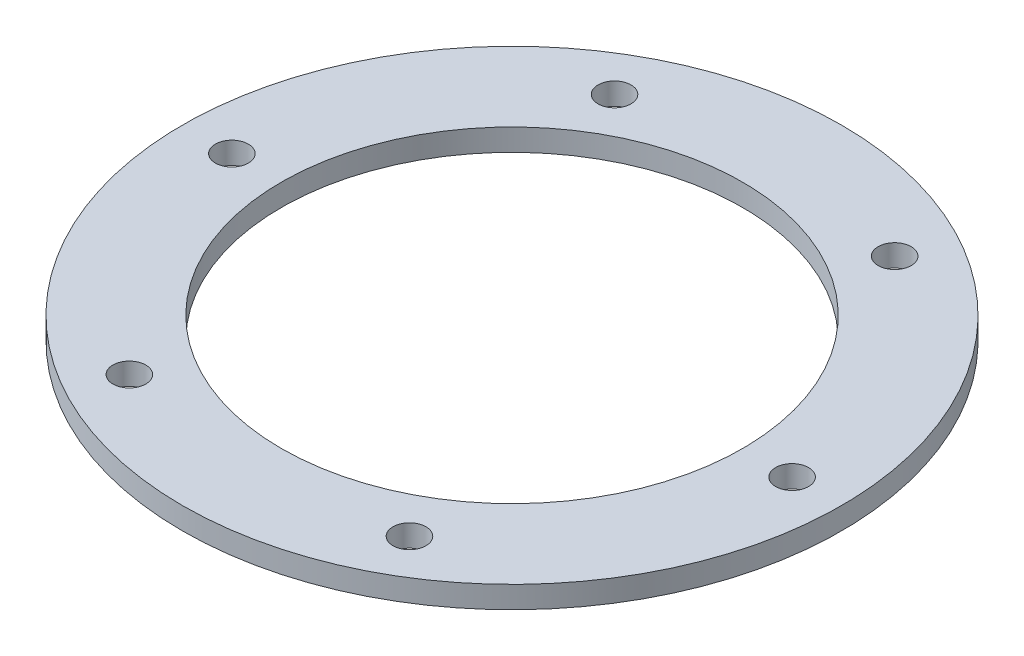
ISO-10303-21;
HEADER;
FILE_DESCRIPTION(('STEP AP214'),'2;1');
FILE_NAME('part.step','',(''),(''),'','','');
FILE_SCHEMA(('AUTOMOTIVE_DESIGN { 1 0 10303 214 1 1 1 1 }'));
ENDSEC;
DATA;
#1=APPLICATION_CONTEXT('core data for automotive mechanical design processes');
#2=APPLICATION_PROTOCOL_DEFINITION('international standard','automotive_design',2000,#1);
#3=PRODUCT_CONTEXT('',#1,'mechanical');
#4=PRODUCT('Part','Part','',(#3));
#5=PRODUCT_RELATED_PRODUCT_CATEGORY('part','',(#4));
#6=PRODUCT_DEFINITION_FORMATION('','',#4);
#7=PRODUCT_DEFINITION_CONTEXT('part definition',#1,'design');
#8=PRODUCT_DEFINITION('design','',#6,#7);
#9=PRODUCT_DEFINITION_SHAPE('','',#8);
#10=(LENGTH_UNIT() NAMED_UNIT(*) SI_UNIT(.MILLI.,.METRE.));
#11=(NAMED_UNIT(*) PLANE_ANGLE_UNIT() SI_UNIT($,.RADIAN.));
#12=(NAMED_UNIT(*) SI_UNIT($,.STERADIAN.) SOLID_ANGLE_UNIT());
#13=UNCERTAINTY_MEASURE_WITH_UNIT(LENGTH_MEASURE(1.E-05),#10,'distance_accuracy_value','');
#14=(GEOMETRIC_REPRESENTATION_CONTEXT(3) GLOBAL_UNCERTAINTY_ASSIGNED_CONTEXT((#13)) GLOBAL_UNIT_ASSIGNED_CONTEXT((#10,
#11,#12)) REPRESENTATION_CONTEXT('',''));
#15=CARTESIAN_POINT('',(0.,0.,0.));
#16=DIRECTION('',(0.,0.,1.));
#17=DIRECTION('',(1.,0.,0.));
#18=AXIS2_PLACEMENT_3D('',#15,#16,#17);
#19=CARTESIAN_POINT('',(0.,2.,0.));
#20=DIRECTION('',(0.,1.,0.));
#21=DIRECTION('',(0.,0.,1.));
#22=AXIS2_PLACEMENT_3D('',#19,#20,#21);
#23=PLANE('',#22);
#24=CARTESIAN_POINT('',(-12.7499999999999,2.,22.0836477965032));
#25=DIRECTION('',(0.,1.,0.));
#26=DIRECTION('',(0.,0.,1.));
#27=AXIS2_PLACEMENT_3D('',#24,#25,#26);
#28=CIRCLE('',#27,1.5);
#29=CARTESIAN_POINT('',(-12.7499999999999,2.,23.5836477965032));
#30=VERTEX_POINT('',#29);
#31=EDGE_CURVE('E71',#30,#30,#28,.T.);
#32=ORIENTED_EDGE('',*,*,#31,.F.);
#33=EDGE_LOOP('',(#32));
#34=FACE_BOUND('',#33,.T.);
#35=CARTESIAN_POINT('',(25.5,2.,0.));
#36=DIRECTION('',(0.,1.,0.));
#37=DIRECTION('',(0.,0.,1.));
#38=AXIS2_PLACEMENT_3D('',#35,#36,#37);
#39=CIRCLE('',#38,1.5);
#40=CARTESIAN_POINT('',(25.5,2.,1.5));
#41=VERTEX_POINT('',#40);
#42=EDGE_CURVE('E59',#41,#41,#39,.T.);
#43=ORIENTED_EDGE('',*,*,#42,.F.);
#44=EDGE_LOOP('',(#43));
#45=FACE_BOUND('',#44,.T.);
#46=CARTESIAN_POINT('',(-12.7499999999999,2.,-22.0836477965032));
#47=DIRECTION('',(0.,1.,0.));
#48=DIRECTION('',(0.,0.,1.));
#49=AXIS2_PLACEMENT_3D('',#46,#47,#48);
#50=CIRCLE('',#49,1.50000000000001);
#51=CARTESIAN_POINT('',(-12.7499999999999,2.,-20.5836477965032));
#52=VERTEX_POINT('',#51);
#53=EDGE_CURVE('E47',#52,#52,#50,.T.);
#54=ORIENTED_EDGE('',*,*,#53,.F.);
#55=EDGE_LOOP('',(#54));
#56=FACE_BOUND('',#55,.T.);
#57=CARTESIAN_POINT('',(0.,2.,0.));
#58=DIRECTION('',(0.,1.,0.));
#59=DIRECTION('',(0.,0.,1.));
#60=AXIS2_PLACEMENT_3D('',#57,#58,#59);
#61=CIRCLE('',#60,30.);
#62=CARTESIAN_POINT('',(0.,2.,30.));
#63=VERTEX_POINT('',#62);
#64=EDGE_CURVE('E10',#63,#63,#61,.T.);
#65=ORIENTED_EDGE('',*,*,#64,.T.);
#66=EDGE_LOOP('',(#65));
#67=FACE_BOUND('',#66,.T.);
#68=CARTESIAN_POINT('',(0.,2.,0.));
#69=DIRECTION('',(0.,1.,0.));
#70=DIRECTION('',(0.,0.,1.));
#71=AXIS2_PLACEMENT_3D('',#68,#69,#70);
#72=CIRCLE('',#71,21.);
#73=CARTESIAN_POINT('',(0.,2.,21.));
#74=VERTEX_POINT('',#73);
#75=EDGE_CURVE('E42',#74,#74,#72,.T.);
#76=ORIENTED_EDGE('',*,*,#75,.F.);
#77=EDGE_LOOP('',(#76));
#78=FACE_BOUND('',#77,.T.);
#79=CARTESIAN_POINT('',(12.7499999999999,2.,-22.0836477965032));
#80=DIRECTION('',(0.,1.,0.));
#81=DIRECTION('',(0.,0.,1.));
#82=AXIS2_PLACEMENT_3D('',#79,#80,#81);
#83=CIRCLE('',#82,1.5);
#84=CARTESIAN_POINT('',(12.7499999999999,2.,-20.5836477965032));
#85=VERTEX_POINT('',#84);
#86=EDGE_CURVE('E53',#85,#85,#83,.T.);
#87=ORIENTED_EDGE('',*,*,#86,.F.);
#88=EDGE_LOOP('',(#87));
#89=FACE_BOUND('',#88,.T.);
#90=CARTESIAN_POINT('',(12.75,2.,22.0836477965032));
#91=DIRECTION('',(0.,1.,0.));
#92=DIRECTION('',(0.,0.,1.));
#93=AXIS2_PLACEMENT_3D('',#90,#91,#92);
#94=CIRCLE('',#93,1.50000000000001);
#95=CARTESIAN_POINT('',(12.75,2.,23.5836477965032));
#96=VERTEX_POINT('',#95);
#97=EDGE_CURVE('E65',#96,#96,#94,.T.);
#98=ORIENTED_EDGE('',*,*,#97,.F.);
#99=EDGE_LOOP('',(#98));
#100=FACE_BOUND('',#99,.T.);
#101=CARTESIAN_POINT('',(-25.5,2.,0.));
#102=DIRECTION('',(0.,1.,0.));
#103=DIRECTION('',(0.,0.,1.));
#104=AXIS2_PLACEMENT_3D('',#101,#102,#103);
#105=CIRCLE('',#104,1.5);
#106=CARTESIAN_POINT('',(-25.5,2.,1.5));
#107=VERTEX_POINT('',#106);
#108=EDGE_CURVE('E77',#107,#107,#105,.T.);
#109=ORIENTED_EDGE('',*,*,#108,.F.);
#110=EDGE_LOOP('',(#109));
#111=FACE_BOUND('',#110,.T.);
#112=ADVANCED_FACE('F31',(#34,#45,#56,#67,#78,#89,#100,#111),#23,.T.);
#113=CARTESIAN_POINT('',(0.,0.,0.));
#114=DIRECTION('',(0.,1.,0.));
#115=DIRECTION('',(0.,0.,1.));
#116=AXIS2_PLACEMENT_3D('',#113,#114,#115);
#117=PLANE('',#116);
#118=CARTESIAN_POINT('',(0.,0.,0.));
#119=DIRECTION('',(0.,1.,0.));
#120=DIRECTION('',(0.,0.,1.));
#121=AXIS2_PLACEMENT_3D('',#118,#119,#120);
#122=CIRCLE('',#121,30.);
#123=CARTESIAN_POINT('',(0.,0.,30.));
#124=VERTEX_POINT('',#123);
#125=EDGE_CURVE('E35',#124,#124,#122,.T.);
#126=ORIENTED_EDGE('',*,*,#125,.F.);
#127=EDGE_LOOP('',(#126));
#128=FACE_BOUND('',#127,.T.);
#129=CARTESIAN_POINT('',(0.,0.,0.));
#130=DIRECTION('',(0.,1.,0.));
#131=DIRECTION('',(0.,0.,1.));
#132=AXIS2_PLACEMENT_3D('',#129,#130,#131);
#133=CIRCLE('',#132,21.);
#134=CARTESIAN_POINT('',(0.,0.,21.));
#135=VERTEX_POINT('',#134);
#136=EDGE_CURVE('E44',#135,#135,#133,.T.);
#137=ORIENTED_EDGE('',*,*,#136,.T.);
#138=EDGE_LOOP('',(#137));
#139=FACE_BOUND('',#138,.T.);
#140=CARTESIAN_POINT('',(-12.7499999999999,0.,-22.0836477965032));
#141=DIRECTION('',(0.,1.,0.));
#142=DIRECTION('',(0.,0.,1.));
#143=AXIS2_PLACEMENT_3D('',#140,#141,#142);
#144=CIRCLE('',#143,1.50000000000001);
#145=CARTESIAN_POINT('',(-12.7499999999999,0.,-20.5836477965032));
#146=VERTEX_POINT('',#145);
#147=EDGE_CURVE('E50',#146,#146,#144,.T.);
#148=ORIENTED_EDGE('',*,*,#147,.T.);
#149=EDGE_LOOP('',(#148));
#150=FACE_BOUND('',#149,.T.);
#151=CARTESIAN_POINT('',(12.7499999999999,0.,-22.0836477965032));
#152=DIRECTION('',(0.,1.,0.));
#153=DIRECTION('',(0.,0.,1.));
#154=AXIS2_PLACEMENT_3D('',#151,#152,#153);
#155=CIRCLE('',#154,1.5);
#156=CARTESIAN_POINT('',(12.7499999999999,0.,-20.5836477965032));
#157=VERTEX_POINT('',#156);
#158=EDGE_CURVE('E56',#157,#157,#155,.T.);
#159=ORIENTED_EDGE('',*,*,#158,.T.);
#160=EDGE_LOOP('',(#159));
#161=FACE_BOUND('',#160,.T.);
#162=CARTESIAN_POINT('',(25.5,0.,0.));
#163=DIRECTION('',(0.,1.,0.));
#164=DIRECTION('',(0.,0.,1.));
#165=AXIS2_PLACEMENT_3D('',#162,#163,#164);
#166=CIRCLE('',#165,1.5);
#167=CARTESIAN_POINT('',(25.5,0.,1.5));
#168=VERTEX_POINT('',#167);
#169=EDGE_CURVE('E62',#168,#168,#166,.T.);
#170=ORIENTED_EDGE('',*,*,#169,.T.);
#171=EDGE_LOOP('',(#170));
#172=FACE_BOUND('',#171,.T.);
#173=CARTESIAN_POINT('',(12.75,0.,22.0836477965032));
#174=DIRECTION('',(0.,1.,0.));
#175=DIRECTION('',(0.,0.,1.));
#176=AXIS2_PLACEMENT_3D('',#173,#174,#175);
#177=CIRCLE('',#176,1.50000000000001);
#178=CARTESIAN_POINT('',(12.75,0.,23.5836477965032));
#179=VERTEX_POINT('',#178);
#180=EDGE_CURVE('E68',#179,#179,#177,.T.);
#181=ORIENTED_EDGE('',*,*,#180,.T.);
#182=EDGE_LOOP('',(#181));
#183=FACE_BOUND('',#182,.T.);
#184=CARTESIAN_POINT('',(-12.7499999999999,0.,22.0836477965032));
#185=DIRECTION('',(0.,1.,0.));
#186=DIRECTION('',(0.,0.,1.));
#187=AXIS2_PLACEMENT_3D('',#184,#185,#186);
#188=CIRCLE('',#187,1.5);
#189=CARTESIAN_POINT('',(-12.7499999999999,0.,23.5836477965032));
#190=VERTEX_POINT('',#189);
#191=EDGE_CURVE('E74',#190,#190,#188,.T.);
#192=ORIENTED_EDGE('',*,*,#191,.T.);
#193=EDGE_LOOP('',(#192));
#194=FACE_BOUND('',#193,.T.);
#195=CARTESIAN_POINT('',(-25.5,0.,0.));
#196=DIRECTION('',(0.,1.,0.));
#197=DIRECTION('',(0.,0.,1.));
#198=AXIS2_PLACEMENT_3D('',#195,#196,#197);
#199=CIRCLE('',#198,1.5);
#200=CARTESIAN_POINT('',(-25.5,0.,1.5));
#201=VERTEX_POINT('',#200);
#202=EDGE_CURVE('E80',#201,#201,#199,.T.);
#203=ORIENTED_EDGE('',*,*,#202,.T.);
#204=EDGE_LOOP('',(#203));
#205=FACE_BOUND('',#204,.T.);
#206=ADVANCED_FACE('F90',(#128,#139,#150,#161,#172,#183,#194,#205),#117,.F.);
#207=CARTESIAN_POINT('',(0.,2.,0.));
#208=DIRECTION('',(0.,-1.,0.));
#209=DIRECTION('',(0.,0.,-1.));
#210=AXIS2_PLACEMENT_3D('',#207,#208,#209);
#211=CYLINDRICAL_SURFACE('',#210,30.);
#212=ORIENTED_EDGE('',*,*,#64,.F.);
#213=EDGE_LOOP('',(#212));
#214=FACE_BOUND('',#213,.T.);
#215=ORIENTED_EDGE('',*,*,#125,.T.);
#216=EDGE_LOOP('',(#215));
#217=FACE_BOUND('',#216,.T.);
#218=ADVANCED_FACE('F33',(#214,#217),#211,.T.);
#219=CARTESIAN_POINT('',(0.,2.,0.));
#220=DIRECTION('',(0.,-1.,0.));
#221=DIRECTION('',(0.,0.,-1.));
#222=AXIS2_PLACEMENT_3D('',#219,#220,#221);
#223=CYLINDRICAL_SURFACE('',#222,21.);
#224=ORIENTED_EDGE('',*,*,#75,.T.);
#225=EDGE_LOOP('',(#224));
#226=FACE_BOUND('',#225,.T.);
#227=ORIENTED_EDGE('',*,*,#136,.F.);
#228=EDGE_LOOP('',(#227));
#229=FACE_BOUND('',#228,.T.);
#230=ADVANCED_FACE('F100',(#226,#229),#223,.F.);
#231=CARTESIAN_POINT('',(-12.7499999999999,2.,-22.0836477965032));
#232=DIRECTION('',(0.,-1.,0.));
#233=DIRECTION('',(0.,0.,-1.));
#234=AXIS2_PLACEMENT_3D('',#231,#232,#233);
#235=CYLINDRICAL_SURFACE('',#234,1.50000000000001);
#236=ORIENTED_EDGE('',*,*,#53,.T.);
#237=EDGE_LOOP('',(#236));
#238=FACE_BOUND('',#237,.T.);
#239=ORIENTED_EDGE('',*,*,#147,.F.);
#240=EDGE_LOOP('',(#239));
#241=FACE_BOUND('',#240,.T.);
#242=ADVANCED_FACE('F103',(#238,#241),#235,.F.);
#243=CARTESIAN_POINT('',(12.7499999999999,2.,-22.0836477965032));
#244=DIRECTION('',(0.,-1.,0.));
#245=DIRECTION('',(0.,0.,-1.));
#246=AXIS2_PLACEMENT_3D('',#243,#244,#245);
#247=CYLINDRICAL_SURFACE('',#246,1.5);
#248=ORIENTED_EDGE('',*,*,#86,.T.);
#249=EDGE_LOOP('',(#248));
#250=FACE_BOUND('',#249,.T.);
#251=ORIENTED_EDGE('',*,*,#158,.F.);
#252=EDGE_LOOP('',(#251));
#253=FACE_BOUND('',#252,.T.);
#254=ADVANCED_FACE('F107',(#250,#253),#247,.F.);
#255=CARTESIAN_POINT('',(25.5,2.,0.));
#256=DIRECTION('',(0.,-1.,0.));
#257=DIRECTION('',(0.,0.,-1.));
#258=AXIS2_PLACEMENT_3D('',#255,#256,#257);
#259=CYLINDRICAL_SURFACE('',#258,1.5);
#260=ORIENTED_EDGE('',*,*,#42,.T.);
#261=EDGE_LOOP('',(#260));
#262=FACE_BOUND('',#261,.T.);
#263=ORIENTED_EDGE('',*,*,#169,.F.);
#264=EDGE_LOOP('',(#263));
#265=FACE_BOUND('',#264,.T.);
#266=ADVANCED_FACE('F111',(#262,#265),#259,.F.);
#267=CARTESIAN_POINT('',(12.75,2.,22.0836477965032));
#268=DIRECTION('',(0.,-1.,0.));
#269=DIRECTION('',(0.,0.,-1.));
#270=AXIS2_PLACEMENT_3D('',#267,#268,#269);
#271=CYLINDRICAL_SURFACE('',#270,1.50000000000001);
#272=ORIENTED_EDGE('',*,*,#97,.T.);
#273=EDGE_LOOP('',(#272));
#274=FACE_BOUND('',#273,.T.);
#275=ORIENTED_EDGE('',*,*,#180,.F.);
#276=EDGE_LOOP('',(#275));
#277=FACE_BOUND('',#276,.T.);
#278=ADVANCED_FACE('F115',(#274,#277),#271,.F.);
#279=CARTESIAN_POINT('',(-12.7499999999999,2.,22.0836477965032));
#280=DIRECTION('',(0.,-1.,0.));
#281=DIRECTION('',(0.,0.,-1.));
#282=AXIS2_PLACEMENT_3D('',#279,#280,#281);
#283=CYLINDRICAL_SURFACE('',#282,1.5);
#284=ORIENTED_EDGE('',*,*,#31,.T.);
#285=EDGE_LOOP('',(#284));
#286=FACE_BOUND('',#285,.T.);
#287=ORIENTED_EDGE('',*,*,#191,.F.);
#288=EDGE_LOOP('',(#287));
#289=FACE_BOUND('',#288,.T.);
#290=ADVANCED_FACE('F119',(#286,#289),#283,.F.);
#291=CARTESIAN_POINT('',(-25.5,2.,0.));
#292=DIRECTION('',(0.,-1.,0.));
#293=DIRECTION('',(0.,0.,-1.));
#294=AXIS2_PLACEMENT_3D('',#291,#292,#293);
#295=CYLINDRICAL_SURFACE('',#294,1.5);
#296=ORIENTED_EDGE('',*,*,#108,.T.);
#297=EDGE_LOOP('',(#296));
#298=FACE_BOUND('',#297,.T.);
#299=ORIENTED_EDGE('',*,*,#202,.F.);
#300=EDGE_LOOP('',(#299));
#301=FACE_BOUND('',#300,.T.);
#302=ADVANCED_FACE('F86',(#298,#301),#295,.F.);
#303=CLOSED_SHELL('',(#112,#206,#218,#230,#242,#254,#266,#278,#290,#302));
#304=MANIFOLD_SOLID_BREP('B2',#303);
#305=ADVANCED_BREP_SHAPE_REPRESENTATION('',(#18,#304),#14);
#306=SHAPE_DEFINITION_REPRESENTATION(#9,#305);
ENDSEC;
END-ISO-10303-21;
